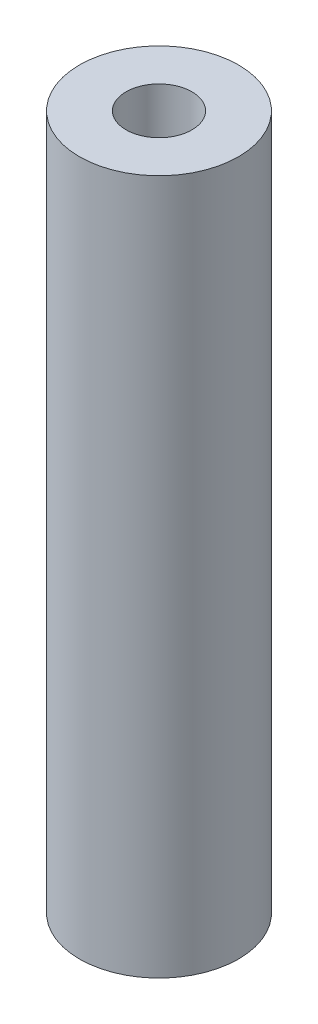
ISO-10303-21;
HEADER;
FILE_DESCRIPTION(('STEP AP214'),'2;1');
FILE_NAME('part.step','',(''),(''),'','','');
FILE_SCHEMA(('AUTOMOTIVE_DESIGN { 1 0 10303 214 1 1 1 1 }'));
ENDSEC;
DATA;
#1=APPLICATION_CONTEXT('core data for automotive mechanical design processes');
#2=APPLICATION_PROTOCOL_DEFINITION('international standard','automotive_design',2000,#1);
#3=PRODUCT_CONTEXT('',#1,'mechanical');
#4=PRODUCT('Part','Part','',(#3));
#5=PRODUCT_RELATED_PRODUCT_CATEGORY('part','',(#4));
#6=PRODUCT_DEFINITION_FORMATION('','',#4);
#7=PRODUCT_DEFINITION_CONTEXT('part definition',#1,'design');
#8=PRODUCT_DEFINITION('design','',#6,#7);
#9=PRODUCT_DEFINITION_SHAPE('','',#8);
#10=(LENGTH_UNIT() NAMED_UNIT(*) SI_UNIT(.MILLI.,.METRE.));
#11=(NAMED_UNIT(*) PLANE_ANGLE_UNIT() SI_UNIT($,.RADIAN.));
#12=(NAMED_UNIT(*) SI_UNIT($,.STERADIAN.) SOLID_ANGLE_UNIT());
#13=UNCERTAINTY_MEASURE_WITH_UNIT(LENGTH_MEASURE(1.E-05),#10,'distance_accuracy_value','');
#14=(GEOMETRIC_REPRESENTATION_CONTEXT(3) GLOBAL_UNCERTAINTY_ASSIGNED_CONTEXT((#13)) GLOBAL_UNIT_ASSIGNED_CONTEXT((#10,
#11,#12)) REPRESENTATION_CONTEXT('',''));
#15=CARTESIAN_POINT('',(0.,0.,0.));
#16=DIRECTION('',(0.,0.,1.));
#17=DIRECTION('',(1.,0.,0.));
#18=AXIS2_PLACEMENT_3D('',#15,#16,#17);
#19=CARTESIAN_POINT('',(0.,64.78,0.));
#20=DIRECTION('',(0.,1.,0.));
#21=DIRECTION('',(0.,0.,1.));
#22=AXIS2_PLACEMENT_3D('',#19,#20,#21);
#23=PLANE('',#22);
#24=CARTESIAN_POINT('',(0.,64.78,0.));
#25=DIRECTION('',(0.,1.,0.));
#26=DIRECTION('',(0.,0.,1.));
#27=AXIS2_PLACEMENT_3D('',#24,#25,#26);
#28=CIRCLE('',#27,7.415);
#29=CARTESIAN_POINT('',(0.,64.78,7.415));
#30=VERTEX_POINT('',#29);
#31=EDGE_CURVE('E10',#30,#30,#28,.T.);
#32=ORIENTED_EDGE('',*,*,#31,.T.);
#33=EDGE_LOOP('',(#32));
#34=FACE_BOUND('',#33,.T.);
#35=CARTESIAN_POINT('',(0.,64.78,0.));
#36=DIRECTION('',(0.,1.,0.));
#37=DIRECTION('',(0.,0.,1.));
#38=AXIS2_PLACEMENT_3D('',#35,#36,#37);
#39=CIRCLE('',#38,3.075);
#40=CARTESIAN_POINT('',(0.,64.78,3.075));
#41=VERTEX_POINT('',#40);
#42=EDGE_CURVE('E54',#41,#41,#39,.T.);
#43=ORIENTED_EDGE('',*,*,#42,.F.);
#44=EDGE_LOOP('',(#43));
#45=FACE_BOUND('',#44,.T.);
#46=ADVANCED_FACE('F41',(#34,#45),#23,.T.);
#47=CARTESIAN_POINT('',(0.,0.,0.));
#48=DIRECTION('',(0.,1.,0.));
#49=DIRECTION('',(0.,0.,1.));
#50=AXIS2_PLACEMENT_3D('',#47,#48,#49);
#51=PLANE('',#50);
#52=CARTESIAN_POINT('',(0.,0.,0.));
#53=DIRECTION('',(0.,1.,0.));
#54=DIRECTION('',(0.,0.,1.));
#55=AXIS2_PLACEMENT_3D('',#52,#53,#54);
#56=CIRCLE('',#55,7.415);
#57=CARTESIAN_POINT('',(0.,0.,7.415));
#58=VERTEX_POINT('',#57);
#59=EDGE_CURVE('E45',#58,#58,#56,.T.);
#60=ORIENTED_EDGE('',*,*,#59,.F.);
#61=EDGE_LOOP('',(#60));
#62=FACE_BOUND('',#61,.T.);
#63=CARTESIAN_POINT('',(0.,0.,0.));
#64=DIRECTION('',(0.,1.,0.));
#65=DIRECTION('',(0.,0.,1.));
#66=AXIS2_PLACEMENT_3D('',#63,#64,#65);
#67=CIRCLE('',#66,3.075);
#68=CARTESIAN_POINT('',(0.,0.,3.075));
#69=VERTEX_POINT('',#68);
#70=EDGE_CURVE('E56',#69,#69,#67,.T.);
#71=ORIENTED_EDGE('',*,*,#70,.T.);
#72=EDGE_LOOP('',(#71));
#73=FACE_BOUND('',#72,.T.);
#74=ADVANCED_FACE('F68',(#62,#73),#51,.F.);
#75=CARTESIAN_POINT('',(0.,64.78,0.));
#76=DIRECTION('',(0.,-1.,0.));
#77=DIRECTION('',(0.,0.,-1.));
#78=AXIS2_PLACEMENT_3D('',#75,#76,#77);
#79=CYLINDRICAL_SURFACE('',#78,7.415);
#80=ORIENTED_EDGE('',*,*,#31,.F.);
#81=EDGE_LOOP('',(#80));
#82=FACE_BOUND('',#81,.T.);
#83=ORIENTED_EDGE('',*,*,#59,.T.);
#84=EDGE_LOOP('',(#83));
#85=FACE_BOUND('',#84,.T.);
#86=ADVANCED_FACE('F43',(#82,#85),#79,.T.);
#87=CARTESIAN_POINT('',(0.,64.78,0.));
#88=DIRECTION('',(0.,-1.,0.));
#89=DIRECTION('',(0.,0.,-1.));
#90=AXIS2_PLACEMENT_3D('',#87,#88,#89);
#91=CYLINDRICAL_SURFACE('',#90,3.075);
#92=ORIENTED_EDGE('',*,*,#42,.T.);
#93=EDGE_LOOP('',(#92));
#94=FACE_BOUND('',#93,.T.);
#95=ORIENTED_EDGE('',*,*,#70,.F.);
#96=EDGE_LOOP('',(#95));
#97=FACE_BOUND('',#96,.T.);
#98=ADVANCED_FACE('F64',(#94,#97),#91,.F.);
#99=CLOSED_SHELL('',(#46,#74,#86,#98));
#100=MANIFOLD_SOLID_BREP('B2',#99);
#101=ADVANCED_BREP_SHAPE_REPRESENTATION('',(#18,#100),#14);
#102=SHAPE_DEFINITION_REPRESENTATION(#9,#101);
ENDSEC;
END-ISO-10303-21;
